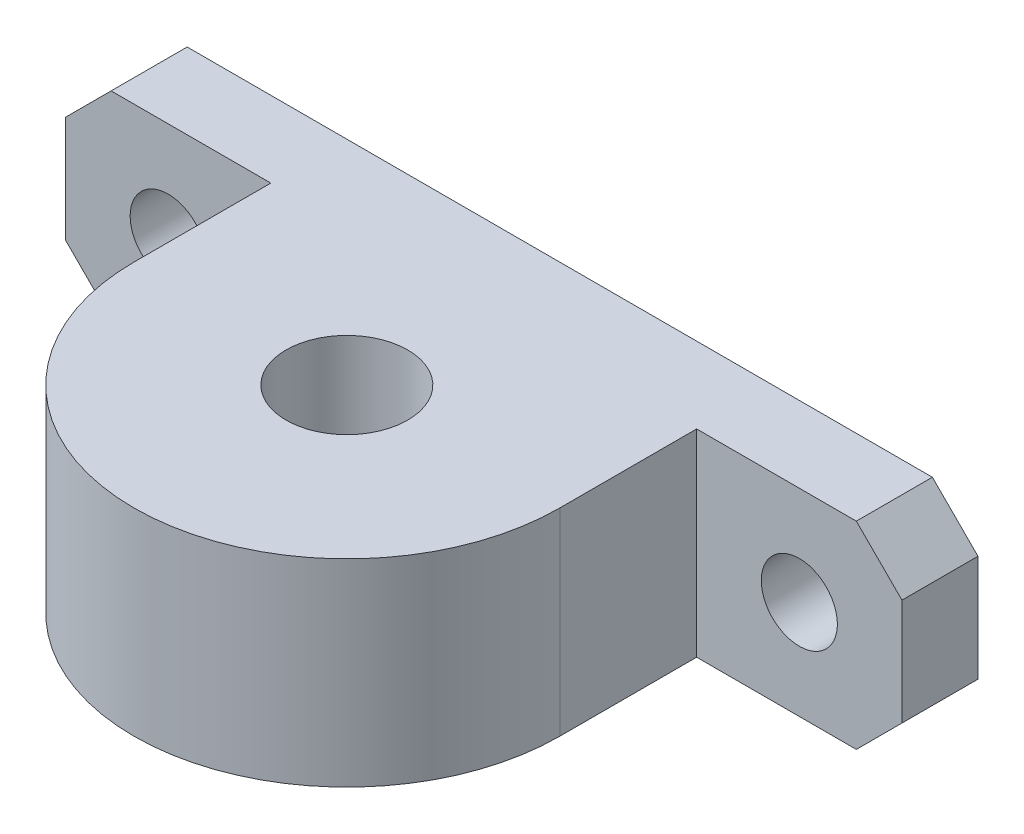
ISO-10303-21;
HEADER;
FILE_DESCRIPTION(('STEP AP214'),'2;1');
FILE_NAME('part.step','',(''),(''),'','','');
FILE_SCHEMA(('AUTOMOTIVE_DESIGN { 1 0 10303 214 1 1 1 1 }'));
ENDSEC;
DATA;
#1=APPLICATION_CONTEXT('core data for automotive mechanical design processes');
#2=APPLICATION_PROTOCOL_DEFINITION('international standard','automotive_design',2000,#1);
#3=PRODUCT_CONTEXT('',#1,'mechanical');
#4=PRODUCT('Part','Part','',(#3));
#5=PRODUCT_RELATED_PRODUCT_CATEGORY('part','',(#4));
#6=PRODUCT_DEFINITION_FORMATION('','',#4);
#7=PRODUCT_DEFINITION_CONTEXT('part definition',#1,'design');
#8=PRODUCT_DEFINITION('design','',#6,#7);
#9=PRODUCT_DEFINITION_SHAPE('','',#8);
#10=(LENGTH_UNIT() NAMED_UNIT(*) SI_UNIT(.MILLI.,.METRE.));
#11=(NAMED_UNIT(*) PLANE_ANGLE_UNIT() SI_UNIT($,.RADIAN.));
#12=(NAMED_UNIT(*) SI_UNIT($,.STERADIAN.) SOLID_ANGLE_UNIT());
#13=UNCERTAINTY_MEASURE_WITH_UNIT(LENGTH_MEASURE(1.E-05),#10,'distance_accuracy_value','');
#14=(GEOMETRIC_REPRESENTATION_CONTEXT(3) GLOBAL_UNCERTAINTY_ASSIGNED_CONTEXT((#13)) GLOBAL_UNIT_ASSIGNED_CONTEXT((#10,
#11,#12)) REPRESENTATION_CONTEXT('',''));
#15=CARTESIAN_POINT('',(0.,0.,0.));
#16=DIRECTION('',(0.,0.,1.));
#17=DIRECTION('',(1.,0.,0.));
#18=AXIS2_PLACEMENT_3D('',#15,#16,#17);
#19=CARTESIAN_POINT('',(0.,13.,0.));
#20=DIRECTION('',(0.,1.,0.));
#21=DIRECTION('',(0.,0.,1.));
#22=AXIS2_PLACEMENT_3D('',#19,#20,#21);
#23=PLANE('',#22);
#24=DIRECTION('',(1.,0.,0.));
#25=VECTOR('',#24,1.);
#26=CARTESIAN_POINT('',(27.5,13.,-9.));
#27=LINE('',#26,#25);
#28=CARTESIAN_POINT('',(14.,13.,-9.));
#29=VERTEX_POINT('',#28);
#30=CARTESIAN_POINT('',(24.5,13.,-9.));
#31=VERTEX_POINT('',#30);
#32=EDGE_CURVE('E148',#29,#31,#27,.T.);
#33=ORIENTED_EDGE('',*,*,#32,.T.);
#34=DIRECTION('',(0.,0.,-1.));
#35=VECTOR('',#34,1.);
#36=CARTESIAN_POINT('',(24.5,13.,-14.));
#37=LINE('',#36,#35);
#38=CARTESIAN_POINT('',(24.5,13.,-14.));
#39=VERTEX_POINT('',#38);
#40=EDGE_CURVE('E192',#31,#39,#37,.T.);
#41=ORIENTED_EDGE('',*,*,#40,.T.);
#42=DIRECTION('',(-1.,0.,0.));
#43=VECTOR('',#42,1.);
#44=CARTESIAN_POINT('',(14.,13.,-14.));
#45=LINE('',#44,#43);
#46=CARTESIAN_POINT('',(-24.5,13.,-14.));
#47=VERTEX_POINT('',#46);
#48=EDGE_CURVE('E150',#39,#47,#45,.T.);
#49=ORIENTED_EDGE('',*,*,#48,.T.);
#50=DIRECTION('',(0.,0.,1.));
#51=VECTOR('',#50,1.);
#52=CARTESIAN_POINT('',(-24.5,13.,-9.));
#53=LINE('',#52,#51);
#54=CARTESIAN_POINT('',(-24.5,13.,-9.));
#55=VERTEX_POINT('',#54);
#56=EDGE_CURVE('E142',#47,#55,#53,.T.);
#57=ORIENTED_EDGE('',*,*,#56,.T.);
#58=DIRECTION('',(1.,0.,0.));
#59=VECTOR('',#58,1.);
#60=CARTESIAN_POINT('',(-27.5,13.,-9.));
#61=LINE('',#60,#59);
#62=CARTESIAN_POINT('',(-14.,13.,-9.));
#63=VERTEX_POINT('',#62);
#64=EDGE_CURVE('E156',#55,#63,#61,.T.);
#65=ORIENTED_EDGE('',*,*,#64,.T.);
#66=DIRECTION('',(0.,0.,1.));
#67=VECTOR('',#66,1.);
#68=CARTESIAN_POINT('',(-14.,13.,0.));
#69=LINE('',#68,#67);
#70=CARTESIAN_POINT('',(-14.,13.,0.));
#71=VERTEX_POINT('',#70);
#72=EDGE_CURVE('E130',#63,#71,#69,.T.);
#73=ORIENTED_EDGE('',*,*,#72,.T.);
#74=CARTESIAN_POINT('',(0.,13.,0.));
#75=DIRECTION('',(0.,1.,0.));
#76=DIRECTION('',(0.,0.,1.));
#77=AXIS2_PLACEMENT_3D('',#74,#75,#76);
#78=CIRCLE('',#77,14.);
#79=CARTESIAN_POINT('',(14.,13.,0.));
#80=VERTEX_POINT('',#79);
#81=EDGE_CURVE('E122',#71,#80,#78,.T.);
#82=ORIENTED_EDGE('',*,*,#81,.T.);
#83=DIRECTION('',(0.,0.,-1.));
#84=VECTOR('',#83,1.);
#85=CARTESIAN_POINT('',(14.,13.,-9.));
#86=LINE('',#85,#84);
#87=EDGE_CURVE('E127',#80,#29,#86,.T.);
#88=ORIENTED_EDGE('',*,*,#87,.T.);
#89=EDGE_LOOP('',(#33,#41,#49,#57,#65,#73,#82,#88));
#90=FACE_BOUND('',#89,.T.);
#91=CARTESIAN_POINT('',(0.,13.,0.));
#92=DIRECTION('',(0.,1.,0.));
#93=DIRECTION('',(0.,0.,1.));
#94=AXIS2_PLACEMENT_3D('',#91,#92,#93);
#95=CIRCLE('',#94,4.);
#96=CARTESIAN_POINT('',(0.,13.,-4.));
#97=VERTEX_POINT('',#96);
#98=EDGE_CURVE('E162',#97,#97,#95,.T.);
#99=ORIENTED_EDGE('',*,*,#98,.F.);
#100=EDGE_LOOP('',(#99));
#101=FACE_BOUND('',#100,.T.);
#102=ADVANCED_FACE('F35',(#90,#101),#23,.T.);
#103=CARTESIAN_POINT('',(0.,0.,0.));
#104=DIRECTION('',(0.,1.,0.));
#105=DIRECTION('',(0.,0.,1.));
#106=AXIS2_PLACEMENT_3D('',#103,#104,#105);
#107=PLANE('',#106);
#108=DIRECTION('',(-1.,0.,0.));
#109=VECTOR('',#108,1.);
#110=CARTESIAN_POINT('',(-14.,0.,-14.));
#111=LINE('',#110,#109);
#112=CARTESIAN_POINT('',(24.5,0.,-14.));
#113=VERTEX_POINT('',#112);
#114=CARTESIAN_POINT('',(-24.5,0.,-14.));
#115=VERTEX_POINT('',#114);
#116=EDGE_CURVE('E167',#113,#115,#111,.T.);
#117=ORIENTED_EDGE('',*,*,#116,.F.);
#118=DIRECTION('',(0.,0.,1.));
#119=VECTOR('',#118,1.);
#120=CARTESIAN_POINT('',(24.5,0.,0.));
#121=LINE('',#120,#119);
#122=CARTESIAN_POINT('',(24.5,0.,-9.));
#123=VERTEX_POINT('',#122);
#124=EDGE_CURVE('E214',#113,#123,#121,.T.);
#125=ORIENTED_EDGE('',*,*,#124,.T.);
#126=DIRECTION('',(1.,0.,0.));
#127=VECTOR('',#126,1.);
#128=CARTESIAN_POINT('',(27.5,0.,-9.));
#129=LINE('',#128,#127);
#130=CARTESIAN_POINT('',(14.,0.,-9.));
#131=VERTEX_POINT('',#130);
#132=EDGE_CURVE('E164',#131,#123,#129,.T.);
#133=ORIENTED_EDGE('',*,*,#132,.F.);
#134=DIRECTION('',(0.,0.,-1.));
#135=VECTOR('',#134,1.);
#136=CARTESIAN_POINT('',(14.,0.,-9.));
#137=LINE('',#136,#135);
#138=CARTESIAN_POINT('',(14.,0.,0.));
#139=VERTEX_POINT('',#138);
#140=EDGE_CURVE('E161',#139,#131,#137,.T.);
#141=ORIENTED_EDGE('',*,*,#140,.F.);
#142=CARTESIAN_POINT('',(0.,0.,0.));
#143=DIRECTION('',(0.,1.,0.));
#144=DIRECTION('',(0.,0.,1.));
#145=AXIS2_PLACEMENT_3D('',#142,#143,#144);
#146=CIRCLE('',#145,14.);
#147=CARTESIAN_POINT('',(-14.,0.,0.));
#148=VERTEX_POINT('',#147);
#149=EDGE_CURVE('E139',#148,#139,#146,.T.);
#150=ORIENTED_EDGE('',*,*,#149,.F.);
#151=DIRECTION('',(0.,0.,1.));
#152=VECTOR('',#151,1.);
#153=CARTESIAN_POINT('',(-14.,0.,0.));
#154=LINE('',#153,#152);
#155=CARTESIAN_POINT('',(-14.,0.,-9.));
#156=VERTEX_POINT('',#155);
#157=EDGE_CURVE('E134',#156,#148,#154,.T.);
#158=ORIENTED_EDGE('',*,*,#157,.F.);
#159=DIRECTION('',(1.,0.,0.));
#160=VECTOR('',#159,1.);
#161=CARTESIAN_POINT('',(-27.5,0.,-9.));
#162=LINE('',#161,#160);
#163=CARTESIAN_POINT('',(-24.5,0.,-9.));
#164=VERTEX_POINT('',#163);
#165=EDGE_CURVE('E170',#164,#156,#162,.T.);
#166=ORIENTED_EDGE('',*,*,#165,.F.);
#167=DIRECTION('',(0.,0.,-1.));
#168=VECTOR('',#167,1.);
#169=CARTESIAN_POINT('',(-24.5,0.,0.));
#170=LINE('',#169,#168);
#171=EDGE_CURVE('E212',#164,#115,#170,.T.);
#172=ORIENTED_EDGE('',*,*,#171,.T.);
#173=EDGE_LOOP('',(#117,#125,#133,#141,#150,#158,#166,#172));
#174=FACE_BOUND('',#173,.T.);
#175=CARTESIAN_POINT('',(0.,0.,0.));
#176=DIRECTION('',(0.,1.,0.));
#177=DIRECTION('',(0.,0.,1.));
#178=AXIS2_PLACEMENT_3D('',#175,#176,#177);
#179=CIRCLE('',#178,4.);
#180=CARTESIAN_POINT('',(0.,0.,-4.));
#181=VERTEX_POINT('',#180);
#182=EDGE_CURVE('E303',#181,#181,#179,.T.);
#183=ORIENTED_EDGE('',*,*,#182,.T.);
#184=EDGE_LOOP('',(#183));
#185=FACE_BOUND('',#184,.T.);
#186=ADVANCED_FACE('F230',(#174,#185),#107,.F.);
#187=CARTESIAN_POINT('',(0.,13.,0.));
#188=DIRECTION('',(0.,-1.,0.));
#189=DIRECTION('',(0.,0.,-1.));
#190=AXIS2_PLACEMENT_3D('',#187,#188,#189);
#191=CYLINDRICAL_SURFACE('',#190,14.);
#192=ORIENTED_EDGE('',*,*,#149,.T.);
#193=DIRECTION('',(0.,-1.,0.));
#194=VECTOR('',#193,1.);
#195=CARTESIAN_POINT('',(14.,13.,0.));
#196=LINE('',#195,#194);
#197=EDGE_CURVE('E137',#80,#139,#196,.T.);
#198=ORIENTED_EDGE('',*,*,#197,.F.);
#199=ORIENTED_EDGE('',*,*,#81,.F.);
#200=DIRECTION('',(0.,-1.,0.));
#201=VECTOR('',#200,1.);
#202=CARTESIAN_POINT('',(-14.,13.,0.));
#203=LINE('',#202,#201);
#204=EDGE_CURVE('E159',#71,#148,#203,.T.);
#205=ORIENTED_EDGE('',*,*,#204,.T.);
#206=EDGE_LOOP('',(#192,#198,#199,#205));
#207=FACE_BOUND('',#206,.T.);
#208=ADVANCED_FACE('F138',(#207),#191,.T.);
#209=CARTESIAN_POINT('',(14.,13.,-9.));
#210=DIRECTION('',(-1.,0.,0.));
#211=DIRECTION('',(0.,0.,1.));
#212=AXIS2_PLACEMENT_3D('',#209,#210,#211);
#213=PLANE('',#212);
#214=ORIENTED_EDGE('',*,*,#140,.T.);
#215=DIRECTION('',(0.,-1.,0.));
#216=VECTOR('',#215,1.);
#217=CARTESIAN_POINT('',(14.,13.,-9.));
#218=LINE('',#217,#216);
#219=EDGE_CURVE('E143',#29,#131,#218,.T.);
#220=ORIENTED_EDGE('',*,*,#219,.F.);
#221=ORIENTED_EDGE('',*,*,#87,.F.);
#222=ORIENTED_EDGE('',*,*,#197,.T.);
#223=EDGE_LOOP('',(#214,#220,#221,#222));
#224=FACE_BOUND('',#223,.T.);
#225=ADVANCED_FACE('F145',(#224),#213,.F.);
#226=CARTESIAN_POINT('',(27.5,13.,-9.));
#227=DIRECTION('',(0.,0.,-1.));
#228=DIRECTION('',(-1.,0.,0.));
#229=AXIS2_PLACEMENT_3D('',#226,#227,#228);
#230=PLANE('',#229);
#231=CARTESIAN_POINT('',(20.75,6.5,-9.));
#232=DIRECTION('',(0.,0.,-1.));
#233=DIRECTION('',(-1.,0.,0.));
#234=AXIS2_PLACEMENT_3D('',#231,#232,#233);
#235=CIRCLE('',#234,2.5);
#236=CARTESIAN_POINT('',(18.25,6.5,-9.));
#237=VERTEX_POINT('',#236);
#238=EDGE_CURVE('E297',#237,#237,#235,.F.);
#239=ORIENTED_EDGE('',*,*,#238,.F.);
#240=EDGE_LOOP('',(#239));
#241=FACE_BOUND('',#240,.T.);
#242=DIRECTION('',(0.,-1.,0.));
#243=VECTOR('',#242,1.);
#244=CARTESIAN_POINT('',(27.5,13.,-9.));
#245=LINE('',#244,#243);
#246=CARTESIAN_POINT('',(27.5,9.99999999999999,-9.));
#247=VERTEX_POINT('',#246);
#248=CARTESIAN_POINT('',(27.5,3.00000000000001,-9.));
#249=VERTEX_POINT('',#248);
#250=EDGE_CURVE('E186',#247,#249,#245,.T.);
#251=ORIENTED_EDGE('',*,*,#250,.F.);
#252=DIRECTION('',(-0.707106781186547,0.707106781186548,0.));
#253=VECTOR('',#252,1.);
#254=CARTESIAN_POINT('',(24.5,13.,-9.));
#255=LINE('',#254,#253);
#256=EDGE_CURVE('E210',#247,#31,#255,.T.);
#257=ORIENTED_EDGE('',*,*,#256,.T.);
#258=ORIENTED_EDGE('',*,*,#32,.F.);
#259=ORIENTED_EDGE('',*,*,#219,.T.);
#260=ORIENTED_EDGE('',*,*,#132,.T.);
#261=DIRECTION('',(-0.707106781186547,-0.707106781186548,0.));
#262=VECTOR('',#261,1.);
#263=CARTESIAN_POINT('',(27.5,3.00000000000001,-9.));
#264=LINE('',#263,#262);
#265=EDGE_CURVE('E208',#123,#249,#264,.F.);
#266=ORIENTED_EDGE('',*,*,#265,.T.);
#267=EDGE_LOOP('',(#251,#257,#258,#259,#260,#266));
#268=FACE_BOUND('',#267,.T.);
#269=ADVANCED_FACE('F245',(#241,#268),#230,.F.);
#270=CARTESIAN_POINT('',(27.5,13.,-14.));
#271=DIRECTION('',(-1.,0.,0.));
#272=DIRECTION('',(0.,0.,1.));
#273=AXIS2_PLACEMENT_3D('',#270,#271,#272);
#274=PLANE('',#273);
#275=DIRECTION('',(0.,-1.,0.));
#276=VECTOR('',#275,1.);
#277=CARTESIAN_POINT('',(27.5,13.,-14.));
#278=LINE('',#277,#276);
#279=CARTESIAN_POINT('',(27.5,9.99999999999999,-14.));
#280=VERTEX_POINT('',#279);
#281=CARTESIAN_POINT('',(27.5,3.00000000000001,-14.));
#282=VERTEX_POINT('',#281);
#283=EDGE_CURVE('E183',#280,#282,#278,.T.);
#284=ORIENTED_EDGE('',*,*,#283,.F.);
#285=DIRECTION('',(0.,0.,1.));
#286=VECTOR('',#285,1.);
#287=CARTESIAN_POINT('',(27.5,9.99999999999999,-9.));
#288=LINE('',#287,#286);
#289=EDGE_CURVE('E206',#280,#247,#288,.T.);
#290=ORIENTED_EDGE('',*,*,#289,.T.);
#291=ORIENTED_EDGE('',*,*,#250,.T.);
#292=DIRECTION('',(0.,0.,-1.));
#293=VECTOR('',#292,1.);
#294=CARTESIAN_POINT('',(27.5,3.00000000000001,-14.));
#295=LINE('',#294,#293);
#296=EDGE_CURVE('E203',#249,#282,#295,.T.);
#297=ORIENTED_EDGE('',*,*,#296,.T.);
#298=EDGE_LOOP('',(#284,#290,#291,#297));
#299=FACE_BOUND('',#298,.T.);
#300=ADVANCED_FACE('F249',(#299),#274,.F.);
#301=CARTESIAN_POINT('',(-14.,13.,-14.));
#302=DIRECTION('',(0.,0.,1.));
#303=DIRECTION('',(1.,0.,0.));
#304=AXIS2_PLACEMENT_3D('',#301,#302,#303);
#305=PLANE('',#304);
#306=CARTESIAN_POINT('',(-20.75,6.5,-14.));
#307=DIRECTION('',(0.,0.,-1.));
#308=DIRECTION('',(-1.,0.,0.));
#309=AXIS2_PLACEMENT_3D('',#306,#307,#308);
#310=CIRCLE('',#309,2.5);
#311=CARTESIAN_POINT('',(-23.25,6.5,-14.));
#312=VERTEX_POINT('',#311);
#313=EDGE_CURVE('E290',#312,#312,#310,.T.);
#314=ORIENTED_EDGE('',*,*,#313,.F.);
#315=EDGE_LOOP('',(#314));
#316=FACE_BOUND('',#315,.T.);
#317=CARTESIAN_POINT('',(20.75,6.5,-14.));
#318=DIRECTION('',(0.,0.,-1.));
#319=DIRECTION('',(-1.,0.,0.));
#320=AXIS2_PLACEMENT_3D('',#317,#318,#319);
#321=CIRCLE('',#320,2.5);
#322=CARTESIAN_POINT('',(18.25,6.5,-14.));
#323=VERTEX_POINT('',#322);
#324=EDGE_CURVE('E294',#323,#323,#321,.T.);
#325=ORIENTED_EDGE('',*,*,#324,.F.);
#326=EDGE_LOOP('',(#325));
#327=FACE_BOUND('',#326,.T.);
#328=ORIENTED_EDGE('',*,*,#48,.F.);
#329=DIRECTION('',(0.707106781186547,-0.707106781186548,0.));
#330=VECTOR('',#329,1.);
#331=CARTESIAN_POINT('',(24.5,13.,-14.));
#332=LINE('',#331,#330);
#333=EDGE_CURVE('E201',#39,#280,#332,.T.);
#334=ORIENTED_EDGE('',*,*,#333,.T.);
#335=ORIENTED_EDGE('',*,*,#283,.T.);
#336=DIRECTION('',(0.707106781186547,0.707106781186548,0.));
#337=VECTOR('',#336,1.);
#338=CARTESIAN_POINT('',(27.5,3.00000000000001,-14.));
#339=LINE('',#338,#337);
#340=EDGE_CURVE('E199',#282,#113,#339,.F.);
#341=ORIENTED_EDGE('',*,*,#340,.T.);
#342=ORIENTED_EDGE('',*,*,#116,.T.);
#343=DIRECTION('',(0.707106781186547,-0.707106781186548,0.));
#344=VECTOR('',#343,1.);
#345=CARTESIAN_POINT('',(-27.5,3.00000000000001,-14.));
#346=LINE('',#345,#344);
#347=CARTESIAN_POINT('',(-27.5,3.00000000000001,-14.));
#348=VERTEX_POINT('',#347);
#349=EDGE_CURVE('E197',#115,#348,#346,.F.);
#350=ORIENTED_EDGE('',*,*,#349,.T.);
#351=DIRECTION('',(0.,-1.,0.));
#352=VECTOR('',#351,1.);
#353=CARTESIAN_POINT('',(-27.5,13.,-14.));
#354=LINE('',#353,#352);
#355=CARTESIAN_POINT('',(-27.5,9.99999999999999,-14.));
#356=VERTEX_POINT('',#355);
#357=EDGE_CURVE('E180',#356,#348,#354,.T.);
#358=ORIENTED_EDGE('',*,*,#357,.F.);
#359=DIRECTION('',(0.707106781186547,0.707106781186548,0.));
#360=VECTOR('',#359,1.);
#361=CARTESIAN_POINT('',(-24.5,13.,-14.));
#362=LINE('',#361,#360);
#363=EDGE_CURVE('E195',#356,#47,#362,.T.);
#364=ORIENTED_EDGE('',*,*,#363,.T.);
#365=EDGE_LOOP('',(#328,#334,#335,#341,#342,#350,#358,#364));
#366=FACE_BOUND('',#365,.T.);
#367=ADVANCED_FACE('F235',(#316,#327,#366),#305,.F.);
#368=CARTESIAN_POINT('',(-27.5,13.,-14.));
#369=DIRECTION('',(1.,0.,0.));
#370=DIRECTION('',(0.,0.,-1.));
#371=AXIS2_PLACEMENT_3D('',#368,#369,#370);
#372=PLANE('',#371);
#373=ORIENTED_EDGE('',*,*,#357,.T.);
#374=DIRECTION('',(0.,0.,1.));
#375=VECTOR('',#374,1.);
#376=CARTESIAN_POINT('',(-27.5,3.00000000000001,-14.));
#377=LINE('',#376,#375);
#378=CARTESIAN_POINT('',(-27.5,3.00000000000001,-9.));
#379=VERTEX_POINT('',#378);
#380=EDGE_CURVE('E218',#348,#379,#377,.T.);
#381=ORIENTED_EDGE('',*,*,#380,.T.);
#382=DIRECTION('',(0.,-1.,0.));
#383=VECTOR('',#382,1.);
#384=CARTESIAN_POINT('',(-27.5,13.,-9.));
#385=LINE('',#384,#383);
#386=CARTESIAN_POINT('',(-27.5,9.99999999999999,-9.));
#387=VERTEX_POINT('',#386);
#388=EDGE_CURVE('E178',#387,#379,#385,.T.);
#389=ORIENTED_EDGE('',*,*,#388,.F.);
#390=DIRECTION('',(0.,0.,-1.));
#391=VECTOR('',#390,1.);
#392=CARTESIAN_POINT('',(-27.5,9.99999999999999,-14.));
#393=LINE('',#392,#391);
#394=EDGE_CURVE('E216',#387,#356,#393,.T.);
#395=ORIENTED_EDGE('',*,*,#394,.T.);
#396=EDGE_LOOP('',(#373,#381,#389,#395));
#397=FACE_BOUND('',#396,.T.);
#398=ADVANCED_FACE('F220',(#397),#372,.F.);
#399=CARTESIAN_POINT('',(-27.5,13.,-9.));
#400=DIRECTION('',(0.,0.,-1.));
#401=DIRECTION('',(-1.,0.,0.));
#402=AXIS2_PLACEMENT_3D('',#399,#400,#401);
#403=PLANE('',#402);
#404=CARTESIAN_POINT('',(-20.75,6.5,-9.));
#405=DIRECTION('',(0.,0.,-1.));
#406=DIRECTION('',(-1.,0.,0.));
#407=AXIS2_PLACEMENT_3D('',#404,#405,#406);
#408=CIRCLE('',#407,2.5);
#409=CARTESIAN_POINT('',(-23.25,6.5,-9.));
#410=VERTEX_POINT('',#409);
#411=EDGE_CURVE('E293',#410,#410,#408,.F.);
#412=ORIENTED_EDGE('',*,*,#411,.F.);
#413=EDGE_LOOP('',(#412));
#414=FACE_BOUND('',#413,.T.);
#415=ORIENTED_EDGE('',*,*,#388,.T.);
#416=DIRECTION('',(-0.707106781186547,0.707106781186548,0.));
#417=VECTOR('',#416,1.);
#418=CARTESIAN_POINT('',(-27.5,3.00000000000001,-9.));
#419=LINE('',#418,#417);
#420=EDGE_CURVE('E11',#379,#164,#419,.F.);
#421=ORIENTED_EDGE('',*,*,#420,.T.);
#422=ORIENTED_EDGE('',*,*,#165,.T.);
#423=DIRECTION('',(0.,-1.,0.));
#424=VECTOR('',#423,1.);
#425=CARTESIAN_POINT('',(-14.,13.,-9.));
#426=LINE('',#425,#424);
#427=EDGE_CURVE('E175',#63,#156,#426,.T.);
#428=ORIENTED_EDGE('',*,*,#427,.F.);
#429=ORIENTED_EDGE('',*,*,#64,.F.);
#430=DIRECTION('',(-0.707106781186547,-0.707106781186548,0.));
#431=VECTOR('',#430,1.);
#432=CARTESIAN_POINT('',(-24.5,13.,-9.));
#433=LINE('',#432,#431);
#434=EDGE_CURVE('E43',#55,#387,#433,.T.);
#435=ORIENTED_EDGE('',*,*,#434,.T.);
#436=EDGE_LOOP('',(#415,#421,#422,#428,#429,#435));
#437=FACE_BOUND('',#436,.T.);
#438=ADVANCED_FACE('F224',(#414,#437),#403,.F.);
#439=CARTESIAN_POINT('',(-14.,13.,0.));
#440=DIRECTION('',(1.,0.,0.));
#441=DIRECTION('',(0.,0.,-1.));
#442=AXIS2_PLACEMENT_3D('',#439,#440,#441);
#443=PLANE('',#442);
#444=ORIENTED_EDGE('',*,*,#157,.T.);
#445=ORIENTED_EDGE('',*,*,#204,.F.);
#446=ORIENTED_EDGE('',*,*,#72,.F.);
#447=ORIENTED_EDGE('',*,*,#427,.T.);
#448=EDGE_LOOP('',(#444,#445,#446,#447));
#449=FACE_BOUND('',#448,.T.);
#450=ADVANCED_FACE('F257',(#449),#443,.F.);
#451=CARTESIAN_POINT('',(0.,13.,0.));
#452=DIRECTION('',(0.,-1.,0.));
#453=DIRECTION('',(0.,0.,-1.));
#454=AXIS2_PLACEMENT_3D('',#451,#452,#453);
#455=CYLINDRICAL_SURFACE('',#454,4.);
#456=CARTESIAN_POINT('',(0.,13.,-4.));
#457=CARTESIAN_POINT('',(0.,12.8645833333333,-4.));
#458=CARTESIAN_POINT('',(0.,12.7291666666667,-4.));
#459=CARTESIAN_POINT('',(0.,12.4583333333333,-4.));
#460=CARTESIAN_POINT('',(0.,12.3229166666667,-4.));
#461=CARTESIAN_POINT('',(0.,12.0520833333333,-4.));
#462=CARTESIAN_POINT('',(0.,11.9166666666667,-4.));
#463=CARTESIAN_POINT('',(0.,11.6458333333333,-4.));
#464=CARTESIAN_POINT('',(0.,11.5104166666667,-4.));
#465=CARTESIAN_POINT('',(0.,11.2395833333333,-4.));
#466=CARTESIAN_POINT('',(0.,11.1041666666667,-4.));
#467=CARTESIAN_POINT('',(0.,10.8333333333333,-4.));
#468=CARTESIAN_POINT('',(0.,10.6979166666667,-4.));
#469=CARTESIAN_POINT('',(0.,10.4270833333333,-4.));
#470=CARTESIAN_POINT('',(0.,10.2916666666667,-4.));
#471=CARTESIAN_POINT('',(0.,10.0208333333333,-4.));
#472=CARTESIAN_POINT('',(0.,9.88541666666667,-4.));
#473=CARTESIAN_POINT('',(0.,9.61458333333333,-4.));
#474=CARTESIAN_POINT('',(0.,9.47916666666667,-4.));
#475=CARTESIAN_POINT('',(0.,9.20833333333333,-4.));
#476=CARTESIAN_POINT('',(0.,9.07291666666667,-4.));
#477=CARTESIAN_POINT('',(0.,8.80208333333333,-4.));
#478=CARTESIAN_POINT('',(0.,8.66666666666667,-4.));
#479=CARTESIAN_POINT('',(0.,8.39583333333333,-4.));
#480=CARTESIAN_POINT('',(0.,8.26041666666667,-4.));
#481=CARTESIAN_POINT('',(0.,7.98958333333333,-4.));
#482=CARTESIAN_POINT('',(0.,7.85416666666667,-4.));
#483=CARTESIAN_POINT('',(0.,7.58333333333333,-4.));
#484=CARTESIAN_POINT('',(0.,7.44791666666667,-4.));
#485=CARTESIAN_POINT('',(0.,7.17708333333333,-4.));
#486=CARTESIAN_POINT('',(0.,7.04166666666667,-4.));
#487=CARTESIAN_POINT('',(0.,6.77083333333333,-4.));
#488=CARTESIAN_POINT('',(0.,6.63541666666667,-4.));
#489=CARTESIAN_POINT('',(0.,6.36458333333333,-4.));
#490=CARTESIAN_POINT('',(0.,6.22916666666667,-4.));
#491=CARTESIAN_POINT('',(0.,5.95833333333333,-4.));
#492=CARTESIAN_POINT('',(0.,5.82291666666667,-4.));
#493=CARTESIAN_POINT('',(0.,5.55208333333333,-4.));
#494=CARTESIAN_POINT('',(0.,5.41666666666667,-4.));
#495=CARTESIAN_POINT('',(0.,5.14583333333333,-4.));
#496=CARTESIAN_POINT('',(0.,5.01041666666667,-4.));
#497=CARTESIAN_POINT('',(0.,4.73958333333333,-4.));
#498=CARTESIAN_POINT('',(0.,4.60416666666667,-4.));
#499=CARTESIAN_POINT('',(0.,4.33333333333333,-4.));
#500=CARTESIAN_POINT('',(0.,4.19791666666667,-4.));
#501=CARTESIAN_POINT('',(0.,3.92708333333333,-4.));
#502=CARTESIAN_POINT('',(0.,3.79166666666667,-4.));
#503=CARTESIAN_POINT('',(0.,3.52083333333333,-4.));
#504=CARTESIAN_POINT('',(0.,3.38541666666667,-4.));
#505=CARTESIAN_POINT('',(0.,3.11458333333333,-4.));
#506=CARTESIAN_POINT('',(0.,2.97916666666667,-4.));
#507=CARTESIAN_POINT('',(0.,2.70833333333333,-4.));
#508=CARTESIAN_POINT('',(0.,2.57291666666667,-4.));
#509=CARTESIAN_POINT('',(0.,2.30208333333333,-4.));
#510=CARTESIAN_POINT('',(0.,2.16666666666667,-4.));
#511=CARTESIAN_POINT('',(0.,1.89583333333333,-4.));
#512=CARTESIAN_POINT('',(0.,1.76041666666667,-4.));
#513=CARTESIAN_POINT('',(0.,1.48958333333333,-4.));
#514=CARTESIAN_POINT('',(0.,1.35416666666667,-4.));
#515=CARTESIAN_POINT('',(0.,1.08333333333333,-4.));
#516=CARTESIAN_POINT('',(0.,0.947916666666667,-4.));
#517=CARTESIAN_POINT('',(0.,0.677083333333334,-4.));
#518=CARTESIAN_POINT('',(0.,0.541666666666667,-4.));
#519=CARTESIAN_POINT('',(0.,0.270833333333334,-4.));
#520=CARTESIAN_POINT('',(0.,0.135416666666667,-4.));
#521=CARTESIAN_POINT('',(0.,0.,-4.));
#522=B_SPLINE_CURVE_WITH_KNOTS('',3,(#456,#457,#458,#459,#460,#461,#462,#463,#464,#465,#466,
#467,#468,#469,#470,#471,#472,#473,#474,#475,#476,#477,#478,#479,#480,#481,#482,#483,#484,#485,
#486,#487,#488,#489,#490,#491,#492,#493,#494,#495,#496,#497,#498,#499,#500,#501,#502,#503,#504,
#505,#506,#507,#508,#509,#510,#511,#512,#513,#514,#515,#516,#517,#518,#519,#520,#521),
.UNSPECIFIED.,.F.,.F.,(4,2,2,2,2,2,2,2,2,2,2,2,2,2,2,2,2,2,2,2,2,2,2,2,2,2,2,2,2,2,2,2,4),(0.,
0.406249999999999,0.812499999999999,1.21875,1.625,2.03125,2.4375,2.84375,3.25,3.65625,4.0625,
4.46875,4.875,5.28125,5.6875,6.09375,6.5,6.90625,7.3125,7.71875,8.125,8.53125,8.9375,9.34375,
9.75,10.15625,10.5625,10.96875,11.375,11.78125,12.1875,12.59375,13.),.UNSPECIFIED.);
#523=EDGE_CURVE('BSEAM259',#97,#181,#522,.T.);
#524=ORIENTED_EDGE('',*,*,#98,.T.);
#525=ORIENTED_EDGE('',*,*,#182,.F.);
#526=ORIENTED_EDGE('',*,*,#523,.T.);
#527=ORIENTED_EDGE('',*,*,#523,.F.);
#528=EDGE_LOOP('',(#524,#526,#525,#527));
#529=FACE_BOUND('',#528,.T.);
#530=ADVANCED_FACE('F259',(#529),#455,.F.);
#531=CARTESIAN_POINT('',(20.75,6.5,14.001));
#532=DIRECTION('',(0.,0.,-1.));
#533=DIRECTION('',(-1.,0.,0.));
#534=AXIS2_PLACEMENT_3D('',#531,#532,#533);
#535=CYLINDRICAL_SURFACE('',#534,2.5);
#536=ORIENTED_EDGE('',*,*,#324,.T.);
#537=EDGE_LOOP('',(#536));
#538=FACE_BOUND('',#537,.T.);
#539=ORIENTED_EDGE('',*,*,#238,.T.);
#540=EDGE_LOOP('',(#539));
#541=FACE_BOUND('',#540,.T.);
#542=ADVANCED_FACE('F265',(#538,#541),#535,.F.);
#543=CARTESIAN_POINT('',(-20.75,6.5,14.001));
#544=DIRECTION('',(0.,0.,-1.));
#545=DIRECTION('',(-1.,0.,0.));
#546=AXIS2_PLACEMENT_3D('',#543,#544,#545);
#547=CYLINDRICAL_SURFACE('',#546,2.5);
#548=ORIENTED_EDGE('',*,*,#313,.T.);
#549=EDGE_LOOP('',(#548));
#550=FACE_BOUND('',#549,.T.);
#551=ORIENTED_EDGE('',*,*,#411,.T.);
#552=EDGE_LOOP('',(#551));
#553=FACE_BOUND('',#552,.T.);
#554=ADVANCED_FACE('F279',(#550,#553),#547,.F.);
#555=CARTESIAN_POINT('',(24.5,13.,0.));
#556=DIRECTION('',(0.707106781186548,0.707106781186547,0.));
#557=DIRECTION('',(0.,0.,1.));
#558=AXIS2_PLACEMENT_3D('',#555,#556,#557);
#559=PLANE('',#558);
#560=ORIENTED_EDGE('',*,*,#256,.F.);
#561=ORIENTED_EDGE('',*,*,#289,.F.);
#562=ORIENTED_EDGE('',*,*,#333,.F.);
#563=ORIENTED_EDGE('',*,*,#40,.F.);
#564=EDGE_LOOP('',(#560,#561,#562,#563));
#565=FACE_BOUND('',#564,.T.);
#566=ADVANCED_FACE('F252',(#565),#559,.T.);
#567=CARTESIAN_POINT('',(27.5,3.00000000000001,-14.));
#568=DIRECTION('',(-0.707106781186548,0.707106781186547,0.));
#569=DIRECTION('',(0.,0.,-1.));
#570=AXIS2_PLACEMENT_3D('',#567,#568,#569);
#571=PLANE('',#570);
#572=ORIENTED_EDGE('',*,*,#265,.F.);
#573=ORIENTED_EDGE('',*,*,#124,.F.);
#574=ORIENTED_EDGE('',*,*,#340,.F.);
#575=ORIENTED_EDGE('',*,*,#296,.F.);
#576=EDGE_LOOP('',(#572,#573,#574,#575));
#577=FACE_BOUND('',#576,.T.);
#578=ADVANCED_FACE('F241',(#577),#571,.F.);
#579=CARTESIAN_POINT('',(-27.5,3.00000000000001,-14.));
#580=DIRECTION('',(0.707106781186548,0.707106781186547,0.));
#581=DIRECTION('',(0.,0.,1.));
#582=AXIS2_PLACEMENT_3D('',#579,#580,#581);
#583=PLANE('',#582);
#584=ORIENTED_EDGE('',*,*,#349,.F.);
#585=ORIENTED_EDGE('',*,*,#171,.F.);
#586=ORIENTED_EDGE('',*,*,#420,.F.);
#587=ORIENTED_EDGE('',*,*,#380,.F.);
#588=EDGE_LOOP('',(#584,#585,#586,#587));
#589=FACE_BOUND('',#588,.T.);
#590=ADVANCED_FACE('F232',(#589),#583,.F.);
#591=CARTESIAN_POINT('',(-24.5,13.,0.));
#592=DIRECTION('',(-0.707106781186548,0.707106781186547,0.));
#593=DIRECTION('',(0.,0.,-1.));
#594=AXIS2_PLACEMENT_3D('',#591,#592,#593);
#595=PLANE('',#594);
#596=ORIENTED_EDGE('',*,*,#363,.F.);
#597=ORIENTED_EDGE('',*,*,#394,.F.);
#598=ORIENTED_EDGE('',*,*,#434,.F.);
#599=ORIENTED_EDGE('',*,*,#56,.F.);
#600=EDGE_LOOP('',(#596,#597,#598,#599));
#601=FACE_BOUND('',#600,.T.);
#602=ADVANCED_FACE('F37',(#601),#595,.T.);
#603=CLOSED_SHELL('',(#102,#186,#208,#225,#269,#300,#367,#398,#438,#450,#530,#542,#554,#566,
#578,#590,#602));
#604=MANIFOLD_SOLID_BREP('B2',#603);
#605=ADVANCED_BREP_SHAPE_REPRESENTATION('',(#18,#604),#14);
#606=SHAPE_DEFINITION_REPRESENTATION(#9,#605);
ENDSEC;
END-ISO-10303-21;
